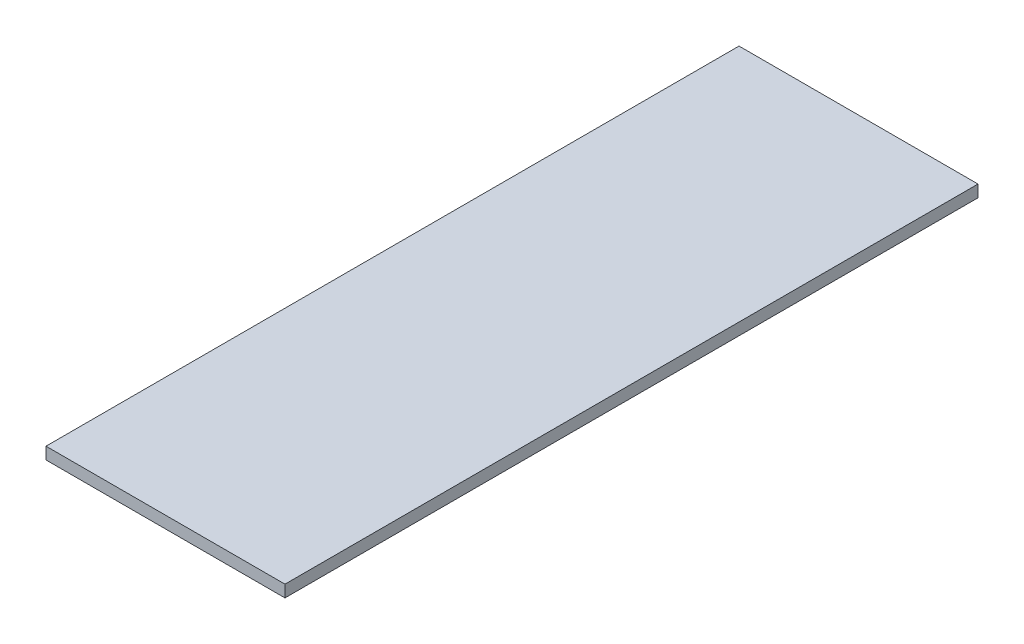
ISO-10303-21;
HEADER;
FILE_DESCRIPTION(('STEP AP214'),'2;1');
FILE_NAME('part.step','',(''),(''),'','','');
FILE_SCHEMA(('AUTOMOTIVE_DESIGN { 1 0 10303 214 1 1 1 1 }'));
ENDSEC;
DATA;
#1=APPLICATION_CONTEXT('core data for automotive mechanical design processes');
#2=APPLICATION_PROTOCOL_DEFINITION('international standard','automotive_design',2000,#1);
#3=PRODUCT_CONTEXT('',#1,'mechanical');
#4=PRODUCT('Part','Part','',(#3));
#5=PRODUCT_RELATED_PRODUCT_CATEGORY('part','',(#4));
#6=PRODUCT_DEFINITION_FORMATION('','',#4);
#7=PRODUCT_DEFINITION_CONTEXT('part definition',#1,'design');
#8=PRODUCT_DEFINITION('design','',#6,#7);
#9=PRODUCT_DEFINITION_SHAPE('','',#8);
#10=(LENGTH_UNIT() NAMED_UNIT(*) SI_UNIT(.MILLI.,.METRE.));
#11=(NAMED_UNIT(*) PLANE_ANGLE_UNIT() SI_UNIT($,.RADIAN.));
#12=(NAMED_UNIT(*) SI_UNIT($,.STERADIAN.) SOLID_ANGLE_UNIT());
#13=UNCERTAINTY_MEASURE_WITH_UNIT(LENGTH_MEASURE(1.E-05),#10,'distance_accuracy_value','');
#14=(GEOMETRIC_REPRESENTATION_CONTEXT(3) GLOBAL_UNCERTAINTY_ASSIGNED_CONTEXT((#13)) GLOBAL_UNIT_ASSIGNED_CONTEXT((#10,
#11,#12)) REPRESENTATION_CONTEXT('',''));
#15=CARTESIAN_POINT('',(0.,0.,0.));
#16=DIRECTION('',(0.,0.,1.));
#17=DIRECTION('',(1.,0.,0.));
#18=AXIS2_PLACEMENT_3D('',#15,#16,#17);
#19=CARTESIAN_POINT('',(0.,10.,0.));
#20=DIRECTION('',(1.,0.,0.));
#21=DIRECTION('',(0.,0.,-1.));
#22=AXIS2_PLACEMENT_3D('',#19,#20,#21);
#23=PLANE('',#22);
#24=DIRECTION('',(0.,0.,1.));
#25=VECTOR('',#24,1.);
#26=CARTESIAN_POINT('',(0.,0.,0.));
#27=LINE('',#26,#25);
#28=CARTESIAN_POINT('',(0.,0.,-580.));
#29=VERTEX_POINT('',#28);
#30=CARTESIAN_POINT('',(0.,0.,0.));
#31=VERTEX_POINT('',#30);
#32=EDGE_CURVE('E96',#29,#31,#27,.T.);
#33=ORIENTED_EDGE('',*,*,#32,.T.);
#34=DIRECTION('',(0.,-1.,0.));
#35=VECTOR('',#34,1.);
#36=CARTESIAN_POINT('',(0.,10.,0.));
#37=LINE('',#36,#35);
#38=CARTESIAN_POINT('',(0.,10.,0.));
#39=VERTEX_POINT('',#38);
#40=EDGE_CURVE('E11',#39,#31,#37,.T.);
#41=ORIENTED_EDGE('',*,*,#40,.F.);
#42=DIRECTION('',(0.,0.,1.));
#43=VECTOR('',#42,1.);
#44=CARTESIAN_POINT('',(0.,10.,0.));
#45=LINE('',#44,#43);
#46=CARTESIAN_POINT('',(0.,10.,-580.));
#47=VERTEX_POINT('',#46);
#48=EDGE_CURVE('E84',#47,#39,#45,.T.);
#49=ORIENTED_EDGE('',*,*,#48,.F.);
#50=DIRECTION('',(0.,-1.,0.));
#51=VECTOR('',#50,1.);
#52=CARTESIAN_POINT('',(0.,10.,-580.));
#53=LINE('',#52,#51);
#54=EDGE_CURVE('E92',#47,#29,#53,.T.);
#55=ORIENTED_EDGE('',*,*,#54,.T.);
#56=EDGE_LOOP('',(#33,#41,#49,#55));
#57=FACE_BOUND('',#56,.T.);
#58=ADVANCED_FACE('F33',(#57),#23,.F.);
#59=CARTESIAN_POINT('',(0.,10.,0.));
#60=DIRECTION('',(0.,0.,-1.));
#61=DIRECTION('',(-1.,0.,0.));
#62=AXIS2_PLACEMENT_3D('',#59,#60,#61);
#63=PLANE('',#62);
#64=DIRECTION('',(1.,0.,0.));
#65=VECTOR('',#64,1.);
#66=CARTESIAN_POINT('',(0.,0.,0.));
#67=LINE('',#66,#65);
#68=CARTESIAN_POINT('',(200.,0.,0.));
#69=VERTEX_POINT('',#68);
#70=EDGE_CURVE('E88',#31,#69,#67,.T.);
#71=ORIENTED_EDGE('',*,*,#70,.T.);
#72=DIRECTION('',(0.,-1.,0.));
#73=VECTOR('',#72,1.);
#74=CARTESIAN_POINT('',(200.,10.,0.));
#75=LINE('',#74,#73);
#76=CARTESIAN_POINT('',(200.,10.,0.));
#77=VERTEX_POINT('',#76);
#78=EDGE_CURVE('E41',#77,#69,#75,.T.);
#79=ORIENTED_EDGE('',*,*,#78,.F.);
#80=DIRECTION('',(1.,0.,0.));
#81=VECTOR('',#80,1.);
#82=CARTESIAN_POINT('',(0.,10.,0.));
#83=LINE('',#82,#81);
#84=EDGE_CURVE('E79',#39,#77,#83,.T.);
#85=ORIENTED_EDGE('',*,*,#84,.F.);
#86=ORIENTED_EDGE('',*,*,#40,.T.);
#87=EDGE_LOOP('',(#71,#79,#85,#86));
#88=FACE_BOUND('',#87,.T.);
#89=ADVANCED_FACE('F87',(#88),#63,.F.);
#90=CARTESIAN_POINT('',(200.,10.,0.));
#91=DIRECTION('',(-1.,0.,0.));
#92=DIRECTION('',(0.,0.,1.));
#93=AXIS2_PLACEMENT_3D('',#90,#91,#92);
#94=PLANE('',#93);
#95=DIRECTION('',(0.,0.,-1.));
#96=VECTOR('',#95,1.);
#97=CARTESIAN_POINT('',(200.,0.,0.));
#98=LINE('',#97,#96);
#99=CARTESIAN_POINT('',(200.,0.,-580.));
#100=VERTEX_POINT('',#99);
#101=EDGE_CURVE('E66',#69,#100,#98,.T.);
#102=ORIENTED_EDGE('',*,*,#101,.T.);
#103=DIRECTION('',(0.,-1.,0.));
#104=VECTOR('',#103,1.);
#105=CARTESIAN_POINT('',(200.,10.,-580.));
#106=LINE('',#105,#104);
#107=CARTESIAN_POINT('',(200.,10.,-580.));
#108=VERTEX_POINT('',#107);
#109=EDGE_CURVE('E89',#108,#100,#106,.T.);
#110=ORIENTED_EDGE('',*,*,#109,.F.);
#111=DIRECTION('',(0.,0.,-1.));
#112=VECTOR('',#111,1.);
#113=CARTESIAN_POINT('',(200.,10.,0.));
#114=LINE('',#113,#112);
#115=EDGE_CURVE('E82',#77,#108,#114,.T.);
#116=ORIENTED_EDGE('',*,*,#115,.F.);
#117=ORIENTED_EDGE('',*,*,#78,.T.);
#118=EDGE_LOOP('',(#102,#110,#116,#117));
#119=FACE_BOUND('',#118,.T.);
#120=ADVANCED_FACE('F90',(#119),#94,.F.);
#121=CARTESIAN_POINT('',(0.,10.,-580.));
#122=DIRECTION('',(0.,0.,1.));
#123=DIRECTION('',(1.,0.,0.));
#124=AXIS2_PLACEMENT_3D('',#121,#122,#123);
#125=PLANE('',#124);
#126=DIRECTION('',(-1.,0.,0.));
#127=VECTOR('',#126,1.);
#128=CARTESIAN_POINT('',(0.,0.,-580.));
#129=LINE('',#128,#127);
#130=EDGE_CURVE('E72',#100,#29,#129,.T.);
#131=ORIENTED_EDGE('',*,*,#130,.T.);
#132=ORIENTED_EDGE('',*,*,#54,.F.);
#133=DIRECTION('',(-1.,0.,0.));
#134=VECTOR('',#133,1.);
#135=CARTESIAN_POINT('',(0.,10.,-580.));
#136=LINE('',#135,#134);
#137=EDGE_CURVE('E49',#108,#47,#136,.T.);
#138=ORIENTED_EDGE('',*,*,#137,.F.);
#139=ORIENTED_EDGE('',*,*,#109,.T.);
#140=EDGE_LOOP('',(#131,#132,#138,#139));
#141=FACE_BOUND('',#140,.T.);
#142=ADVANCED_FACE('F103',(#141),#125,.F.);
#143=CARTESIAN_POINT('',(0.,10.,0.));
#144=DIRECTION('',(0.,-1.,0.));
#145=DIRECTION('',(0.,0.,-1.));
#146=AXIS2_PLACEMENT_3D('',#143,#144,#145);
#147=PLANE('',#146);
#148=ORIENTED_EDGE('',*,*,#48,.T.);
#149=ORIENTED_EDGE('',*,*,#84,.T.);
#150=ORIENTED_EDGE('',*,*,#115,.T.);
#151=ORIENTED_EDGE('',*,*,#137,.T.);
#152=EDGE_LOOP('',(#148,#149,#150,#151));
#153=FACE_BOUND('',#152,.T.);
#154=ADVANCED_FACE('F80',(#153),#147,.F.);
#155=CARTESIAN_POINT('',(0.,0.,0.));
#156=DIRECTION('',(0.,-1.,0.));
#157=DIRECTION('',(0.,0.,-1.));
#158=AXIS2_PLACEMENT_3D('',#155,#156,#157);
#159=PLANE('',#158);
#160=ORIENTED_EDGE('',*,*,#32,.F.);
#161=ORIENTED_EDGE('',*,*,#130,.F.);
#162=ORIENTED_EDGE('',*,*,#101,.F.);
#163=ORIENTED_EDGE('',*,*,#70,.F.);
#164=EDGE_LOOP('',(#160,#161,#162,#163));
#165=FACE_BOUND('',#164,.T.);
#166=ADVANCED_FACE('F106',(#165),#159,.T.);
#167=CLOSED_SHELL('',(#58,#89,#120,#142,#154,#166));
#168=MANIFOLD_SOLID_BREP('B2',#167);
#169=ADVANCED_BREP_SHAPE_REPRESENTATION('',(#18,#168),#14);
#170=SHAPE_DEFINITION_REPRESENTATION(#9,#169);
ENDSEC;
END-ISO-10303-21;
